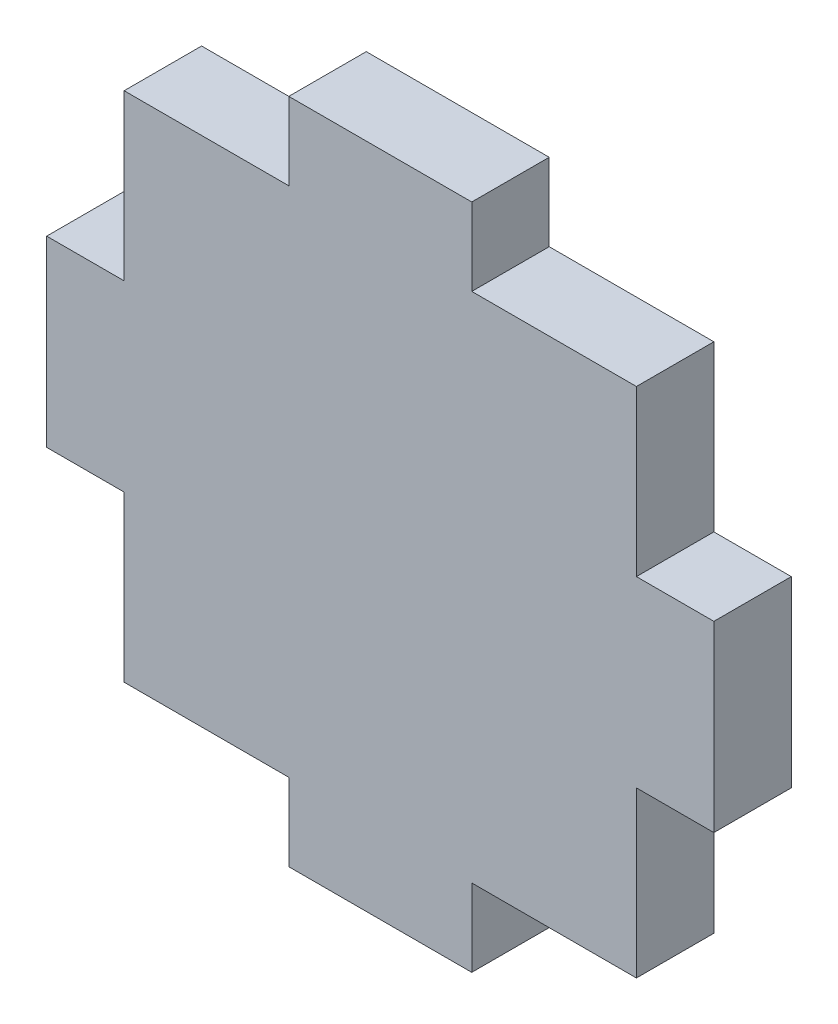
ISO-10303-21;
HEADER;
FILE_DESCRIPTION(('STEP AP214'),'2;1');
FILE_NAME('part.step','',(''),(''),'','','');
FILE_SCHEMA(('AUTOMOTIVE_DESIGN { 1 0 10303 214 1 1 1 1 }'));
ENDSEC;
DATA;
#1=APPLICATION_CONTEXT('core data for automotive mechanical design processes');
#2=APPLICATION_PROTOCOL_DEFINITION('international standard','automotive_design',2000,#1);
#3=PRODUCT_CONTEXT('',#1,'mechanical');
#4=PRODUCT('Part','Part','',(#3));
#5=PRODUCT_RELATED_PRODUCT_CATEGORY('part','',(#4));
#6=PRODUCT_DEFINITION_FORMATION('','',#4);
#7=PRODUCT_DEFINITION_CONTEXT('part definition',#1,'design');
#8=PRODUCT_DEFINITION('design','',#6,#7);
#9=PRODUCT_DEFINITION_SHAPE('','',#8);
#10=(LENGTH_UNIT() NAMED_UNIT(*) SI_UNIT(.MILLI.,.METRE.));
#11=(NAMED_UNIT(*) PLANE_ANGLE_UNIT() SI_UNIT($,.RADIAN.));
#12=(NAMED_UNIT(*) SI_UNIT($,.STERADIAN.) SOLID_ANGLE_UNIT());
#13=UNCERTAINTY_MEASURE_WITH_UNIT(LENGTH_MEASURE(1.E-05),#10,'distance_accuracy_value','');
#14=(GEOMETRIC_REPRESENTATION_CONTEXT(3) GLOBAL_UNCERTAINTY_ASSIGNED_CONTEXT((#13)) GLOBAL_UNIT_ASSIGNED_CONTEXT((#10,
#11,#12)) REPRESENTATION_CONTEXT('',''));
#15=CARTESIAN_POINT('',(0.,0.,0.));
#16=DIRECTION('',(0.,0.,1.));
#17=DIRECTION('',(1.,0.,0.));
#18=AXIS2_PLACEMENT_3D('',#15,#16,#17);
#19=CARTESIAN_POINT('',(-27.35,-27.35,6.35));
#20=DIRECTION('',(1.,0.,0.));
#21=DIRECTION('',(0.,0.,-1.));
#22=AXIS2_PLACEMENT_3D('',#19,#20,#21);
#23=PLANE('',#22);
#24=DIRECTION('',(0.,0.,1.));
#25=VECTOR('',#24,1.);
#26=CARTESIAN_POINT('',(-27.35,-7.50000000000001,0.));
#27=LINE('',#26,#25);
#28=CARTESIAN_POINT('',(-27.35,-7.50000000000001,0.));
#29=VERTEX_POINT('',#28);
#30=CARTESIAN_POINT('',(-27.35,-7.50000000000001,6.35));
#31=VERTEX_POINT('',#30);
#32=EDGE_CURVE('E261',#29,#31,#27,.T.);
#33=ORIENTED_EDGE('',*,*,#32,.T.);
#34=DIRECTION('',(0.,-1.,0.));
#35=VECTOR('',#34,1.);
#36=CARTESIAN_POINT('',(-27.35,-27.35,6.35));
#37=LINE('',#36,#35);
#38=CARTESIAN_POINT('',(-27.35,7.5,6.35));
#39=VERTEX_POINT('',#38);
#40=EDGE_CURVE('E374',#39,#31,#37,.T.);
#41=ORIENTED_EDGE('',*,*,#40,.F.);
#42=DIRECTION('',(0.,0.,1.));
#43=VECTOR('',#42,1.);
#44=CARTESIAN_POINT('',(-27.35,7.5,0.));
#45=LINE('',#44,#43);
#46=CARTESIAN_POINT('',(-27.35,7.5,0.));
#47=VERTEX_POINT('',#46);
#48=EDGE_CURVE('E362',#47,#39,#45,.T.);
#49=ORIENTED_EDGE('',*,*,#48,.F.);
#50=DIRECTION('',(0.,-1.,0.));
#51=VECTOR('',#50,1.);
#52=CARTESIAN_POINT('',(-27.35,-27.35,0.));
#53=LINE('',#52,#51);
#54=EDGE_CURVE('E361',#47,#29,#53,.T.);
#55=ORIENTED_EDGE('',*,*,#54,.T.);
#56=EDGE_LOOP('',(#33,#41,#49,#55));
#57=FACE_BOUND('',#56,.T.);
#58=ADVANCED_FACE('F39',(#57),#23,.F.);
#59=CARTESIAN_POINT('',(27.35,-27.35,6.35));
#60=DIRECTION('',(0.,1.,0.));
#61=DIRECTION('',(-1.,0.,0.));
#62=AXIS2_PLACEMENT_3D('',#59,#60,#61);
#63=PLANE('',#62);
#64=DIRECTION('',(1.,0.,0.));
#65=VECTOR('',#64,1.);
#66=CARTESIAN_POINT('',(27.35,-27.35,6.35));
#67=LINE('',#66,#65);
#68=CARTESIAN_POINT('',(-7.50000000000001,-27.35,6.35));
#69=VERTEX_POINT('',#68);
#70=CARTESIAN_POINT('',(7.49999999999999,-27.35,6.35));
#71=VERTEX_POINT('',#70);
#72=EDGE_CURVE('E378',#69,#71,#67,.T.);
#73=ORIENTED_EDGE('',*,*,#72,.F.);
#74=DIRECTION('',(0.,0.,1.));
#75=VECTOR('',#74,1.);
#76=CARTESIAN_POINT('',(-7.50000000000001,-27.35,0.));
#77=LINE('',#76,#75);
#78=CARTESIAN_POINT('',(-7.50000000000001,-27.35,0.));
#79=VERTEX_POINT('',#78);
#80=EDGE_CURVE('E299',#79,#69,#77,.T.);
#81=ORIENTED_EDGE('',*,*,#80,.F.);
#82=DIRECTION('',(1.,0.,0.));
#83=VECTOR('',#82,1.);
#84=CARTESIAN_POINT('',(27.35,-27.35,0.));
#85=LINE('',#84,#83);
#86=CARTESIAN_POINT('',(7.49999999999999,-27.35,0.));
#87=VERTEX_POINT('',#86);
#88=EDGE_CURVE('E388',#79,#87,#85,.T.);
#89=ORIENTED_EDGE('',*,*,#88,.T.);
#90=DIRECTION('',(0.,0.,1.));
#91=VECTOR('',#90,1.);
#92=CARTESIAN_POINT('',(7.49999999999999,-27.35,0.));
#93=LINE('',#92,#91);
#94=EDGE_CURVE('E276',#87,#71,#93,.T.);
#95=ORIENTED_EDGE('',*,*,#94,.T.);
#96=EDGE_LOOP('',(#73,#81,#89,#95));
#97=FACE_BOUND('',#96,.T.);
#98=ADVANCED_FACE('F426',(#97),#63,.F.);
#99=CARTESIAN_POINT('',(27.35,-27.35,6.35));
#100=DIRECTION('',(-1.,0.,0.));
#101=DIRECTION('',(0.,0.,1.));
#102=AXIS2_PLACEMENT_3D('',#99,#100,#101);
#103=PLANE('',#102);
#104=DIRECTION('',(0.,1.,0.));
#105=VECTOR('',#104,1.);
#106=CARTESIAN_POINT('',(27.35,-27.35,6.35));
#107=LINE('',#106,#105);
#108=CARTESIAN_POINT('',(27.35,-7.5,6.35));
#109=VERTEX_POINT('',#108);
#110=CARTESIAN_POINT('',(27.35,7.50000000000001,6.35));
#111=VERTEX_POINT('',#110);
#112=EDGE_CURVE('E48',#109,#111,#107,.T.);
#113=ORIENTED_EDGE('',*,*,#112,.F.);
#114=DIRECTION('',(0.,0.,1.));
#115=VECTOR('',#114,1.);
#116=CARTESIAN_POINT('',(27.35,-7.5,0.));
#117=LINE('',#116,#115);
#118=CARTESIAN_POINT('',(27.35,-7.5,0.));
#119=VERTEX_POINT('',#118);
#120=EDGE_CURVE('E273',#119,#109,#117,.T.);
#121=ORIENTED_EDGE('',*,*,#120,.F.);
#122=DIRECTION('',(0.,1.,0.));
#123=VECTOR('',#122,1.);
#124=CARTESIAN_POINT('',(27.35,-27.35,0.));
#125=LINE('',#124,#123);
#126=CARTESIAN_POINT('',(27.35,7.50000000000001,0.));
#127=VERTEX_POINT('',#126);
#128=EDGE_CURVE('E391',#119,#127,#125,.T.);
#129=ORIENTED_EDGE('',*,*,#128,.T.);
#130=DIRECTION('',(0.,0.,1.));
#131=VECTOR('',#130,1.);
#132=CARTESIAN_POINT('',(27.35,7.50000000000001,0.));
#133=LINE('',#132,#131);
#134=EDGE_CURVE('E234',#127,#111,#133,.T.);
#135=ORIENTED_EDGE('',*,*,#134,.T.);
#136=EDGE_LOOP('',(#113,#121,#129,#135));
#137=FACE_BOUND('',#136,.T.);
#138=ADVANCED_FACE('F431',(#137),#103,.F.);
#139=CARTESIAN_POINT('',(27.35,27.35,6.35));
#140=DIRECTION('',(0.,-1.,0.));
#141=DIRECTION('',(1.,0.,0.));
#142=AXIS2_PLACEMENT_3D('',#139,#140,#141);
#143=PLANE('',#142);
#144=DIRECTION('',(-1.,0.,0.));
#145=VECTOR('',#144,1.);
#146=CARTESIAN_POINT('',(27.35,27.35,6.35));
#147=LINE('',#146,#145);
#148=CARTESIAN_POINT('',(7.49999999999999,27.35,6.35));
#149=VERTEX_POINT('',#148);
#150=CARTESIAN_POINT('',(-7.50000000000001,27.35,6.35));
#151=VERTEX_POINT('',#150);
#152=EDGE_CURVE('E11',#149,#151,#147,.T.);
#153=ORIENTED_EDGE('',*,*,#152,.F.);
#154=DIRECTION('',(0.,0.,1.));
#155=VECTOR('',#154,1.);
#156=CARTESIAN_POINT('',(7.49999999999999,27.35,0.));
#157=LINE('',#156,#155);
#158=CARTESIAN_POINT('',(7.49999999999999,27.35,0.));
#159=VERTEX_POINT('',#158);
#160=EDGE_CURVE('E231',#159,#149,#157,.T.);
#161=ORIENTED_EDGE('',*,*,#160,.F.);
#162=DIRECTION('',(-1.,0.,0.));
#163=VECTOR('',#162,1.);
#164=CARTESIAN_POINT('',(27.35,27.35,0.));
#165=LINE('',#164,#163);
#166=CARTESIAN_POINT('',(-7.50000000000001,27.35,0.));
#167=VERTEX_POINT('',#166);
#168=EDGE_CURVE('E42',#159,#167,#165,.T.);
#169=ORIENTED_EDGE('',*,*,#168,.T.);
#170=DIRECTION('',(0.,0.,1.));
#171=VECTOR('',#170,1.);
#172=CARTESIAN_POINT('',(-7.50000000000001,27.35,0.));
#173=LINE('',#172,#171);
#174=EDGE_CURVE('E365',#167,#151,#173,.T.);
#175=ORIENTED_EDGE('',*,*,#174,.T.);
#176=EDGE_LOOP('',(#153,#161,#169,#175));
#177=FACE_BOUND('',#176,.T.);
#178=ADVANCED_FACE('F402',(#177),#143,.F.);
#179=CARTESIAN_POINT('',(0.,0.,6.35));
#180=DIRECTION('',(0.,0.,1.));
#181=DIRECTION('',(1.,0.,0.));
#182=AXIS2_PLACEMENT_3D('',#179,#180,#181);
#183=PLANE('',#182);
#184=ORIENTED_EDGE('',*,*,#40,.T.);
#185=DIRECTION('',(1.,0.,0.));
#186=VECTOR('',#185,1.);
#187=CARTESIAN_POINT('',(0.,-7.50000000000001,6.35));
#188=LINE('',#187,#186);
#189=CARTESIAN_POINT('',(-21.,-7.50000000000001,6.35));
#190=VERTEX_POINT('',#189);
#191=EDGE_CURVE('E289',#31,#190,#188,.T.);
#192=ORIENTED_EDGE('',*,*,#191,.T.);
#193=DIRECTION('',(0.,1.,0.));
#194=VECTOR('',#193,1.);
#195=CARTESIAN_POINT('',(-21.,0.,6.35));
#196=LINE('',#195,#194);
#197=CARTESIAN_POINT('',(-21.,-21.,6.35));
#198=VERTEX_POINT('',#197);
#199=EDGE_CURVE('E307',#198,#190,#196,.T.);
#200=ORIENTED_EDGE('',*,*,#199,.F.);
#201=DIRECTION('',(1.,0.,0.));
#202=VECTOR('',#201,1.);
#203=CARTESIAN_POINT('',(0.,-21.,6.35));
#204=LINE('',#203,#202);
#205=CARTESIAN_POINT('',(-7.50000000000001,-21.,6.35));
#206=VERTEX_POINT('',#205);
#207=EDGE_CURVE('E303',#198,#206,#204,.T.);
#208=ORIENTED_EDGE('',*,*,#207,.T.);
#209=DIRECTION('',(0.,1.,0.));
#210=VECTOR('',#209,1.);
#211=CARTESIAN_POINT('',(-7.5,0.,6.35));
#212=LINE('',#211,#210);
#213=EDGE_CURVE('E300',#69,#206,#212,.T.);
#214=ORIENTED_EDGE('',*,*,#213,.F.);
#215=ORIENTED_EDGE('',*,*,#72,.T.);
#216=DIRECTION('',(0.,1.,0.));
#217=VECTOR('',#216,1.);
#218=CARTESIAN_POINT('',(7.49999999999999,0.,6.35));
#219=LINE('',#218,#217);
#220=CARTESIAN_POINT('',(7.49999999999999,-21.,6.35));
#221=VERTEX_POINT('',#220);
#222=EDGE_CURVE('E264',#71,#221,#219,.T.);
#223=ORIENTED_EDGE('',*,*,#222,.T.);
#224=DIRECTION('',(-1.,0.,0.));
#225=VECTOR('',#224,1.);
#226=CARTESIAN_POINT('',(0.,-21.,6.35));
#227=LINE('',#226,#225);
#228=CARTESIAN_POINT('',(21.,-21.,6.35));
#229=VERTEX_POINT('',#228);
#230=EDGE_CURVE('E260',#229,#221,#227,.T.);
#231=ORIENTED_EDGE('',*,*,#230,.F.);
#232=DIRECTION('',(0.,1.,0.));
#233=VECTOR('',#232,1.);
#234=CARTESIAN_POINT('',(21.,0.,6.35));
#235=LINE('',#234,#233);
#236=CARTESIAN_POINT('',(21.,-7.5,6.35));
#237=VERTEX_POINT('',#236);
#238=EDGE_CURVE('E256',#229,#237,#235,.T.);
#239=ORIENTED_EDGE('',*,*,#238,.T.);
#240=DIRECTION('',(-1.,0.,0.));
#241=VECTOR('',#240,1.);
#242=CARTESIAN_POINT('',(0.,-7.50000000000001,6.35));
#243=LINE('',#242,#241);
#244=EDGE_CURVE('E244',#109,#237,#243,.T.);
#245=ORIENTED_EDGE('',*,*,#244,.F.);
#246=ORIENTED_EDGE('',*,*,#112,.T.);
#247=DIRECTION('',(-1.,0.,0.));
#248=VECTOR('',#247,1.);
#249=CARTESIAN_POINT('',(0.,7.50000000000001,6.35));
#250=LINE('',#249,#248);
#251=CARTESIAN_POINT('',(21.,7.50000000000001,6.35));
#252=VERTEX_POINT('',#251);
#253=EDGE_CURVE('E211',#111,#252,#250,.T.);
#254=ORIENTED_EDGE('',*,*,#253,.T.);
#255=DIRECTION('',(0.,-1.,0.));
#256=VECTOR('',#255,1.);
#257=CARTESIAN_POINT('',(21.,0.,6.35));
#258=LINE('',#257,#256);
#259=CARTESIAN_POINT('',(21.,21.,6.35));
#260=VERTEX_POINT('',#259);
#261=EDGE_CURVE('E220',#260,#252,#258,.T.);
#262=ORIENTED_EDGE('',*,*,#261,.F.);
#263=DIRECTION('',(-1.,0.,0.));
#264=VECTOR('',#263,1.);
#265=CARTESIAN_POINT('',(0.,21.,6.35));
#266=LINE('',#265,#264);
#267=CARTESIAN_POINT('',(7.49999999999999,21.,6.35));
#268=VERTEX_POINT('',#267);
#269=EDGE_CURVE('E185',#260,#268,#266,.T.);
#270=ORIENTED_EDGE('',*,*,#269,.T.);
#271=DIRECTION('',(0.,-1.,0.));
#272=VECTOR('',#271,1.);
#273=CARTESIAN_POINT('',(7.49999999999999,0.,6.35));
#274=LINE('',#273,#272);
#275=EDGE_CURVE('E207',#149,#268,#274,.T.);
#276=ORIENTED_EDGE('',*,*,#275,.F.);
#277=ORIENTED_EDGE('',*,*,#152,.T.);
#278=DIRECTION('',(0.,-1.,0.));
#279=VECTOR('',#278,1.);
#280=CARTESIAN_POINT('',(-7.50000000000002,0.,6.35));
#281=LINE('',#280,#279);
#282=CARTESIAN_POINT('',(-7.50000000000001,21.,6.35));
#283=VERTEX_POINT('',#282);
#284=EDGE_CURVE('E351',#151,#283,#281,.T.);
#285=ORIENTED_EDGE('',*,*,#284,.T.);
#286=DIRECTION('',(1.,0.,0.));
#287=VECTOR('',#286,1.);
#288=CARTESIAN_POINT('',(0.,21.,6.35));
#289=LINE('',#288,#287);
#290=CARTESIAN_POINT('',(-21.,21.,6.35));
#291=VERTEX_POINT('',#290);
#292=EDGE_CURVE('E347',#291,#283,#289,.T.);
#293=ORIENTED_EDGE('',*,*,#292,.F.);
#294=DIRECTION('',(0.,-1.,0.));
#295=VECTOR('',#294,1.);
#296=CARTESIAN_POINT('',(-21.,0.,6.35));
#297=LINE('',#296,#295);
#298=CARTESIAN_POINT('',(-21.,7.5,6.35));
#299=VERTEX_POINT('',#298);
#300=EDGE_CURVE('E230',#291,#299,#297,.T.);
#301=ORIENTED_EDGE('',*,*,#300,.T.);
#302=DIRECTION('',(1.,0.,0.));
#303=VECTOR('',#302,1.);
#304=CARTESIAN_POINT('',(0.,7.5,6.35));
#305=LINE('',#304,#303);
#306=EDGE_CURVE('E331',#39,#299,#305,.T.);
#307=ORIENTED_EDGE('',*,*,#306,.F.);
#308=EDGE_LOOP('',(#184,#192,#200,#208,#214,#215,#223,#231,#239,#245,#246,#254,#262,#270,#276,
#277,#285,#293,#301,#307));
#309=FACE_BOUND('',#308,.T.);
#310=ADVANCED_FACE('F410',(#309),#183,.T.);
#311=CARTESIAN_POINT('',(0.,0.,0.));
#312=DIRECTION('',(0.,0.,1.));
#313=DIRECTION('',(1.,0.,0.));
#314=AXIS2_PLACEMENT_3D('',#311,#312,#313);
#315=PLANE('',#314);
#316=DIRECTION('',(1.,0.,0.));
#317=VECTOR('',#316,1.);
#318=CARTESIAN_POINT('',(0.,-7.50000000000001,0.));
#319=LINE('',#318,#317);
#320=CARTESIAN_POINT('',(-21.,-7.50000000000001,0.));
#321=VERTEX_POINT('',#320);
#322=EDGE_CURVE('E296',#29,#321,#319,.T.);
#323=ORIENTED_EDGE('',*,*,#322,.F.);
#324=ORIENTED_EDGE('',*,*,#54,.F.);
#325=DIRECTION('',(1.,0.,0.));
#326=VECTOR('',#325,1.);
#327=CARTESIAN_POINT('',(0.,7.5,0.));
#328=LINE('',#327,#326);
#329=CARTESIAN_POINT('',(-21.,7.5,0.));
#330=VERTEX_POINT('',#329);
#331=EDGE_CURVE('E339',#47,#330,#328,.T.);
#332=ORIENTED_EDGE('',*,*,#331,.T.);
#333=DIRECTION('',(0.,-1.,0.));
#334=VECTOR('',#333,1.);
#335=CARTESIAN_POINT('',(-21.,0.,0.));
#336=LINE('',#335,#334);
#337=CARTESIAN_POINT('',(-21.,21.,0.));
#338=VERTEX_POINT('',#337);
#339=EDGE_CURVE('E327',#338,#330,#336,.T.);
#340=ORIENTED_EDGE('',*,*,#339,.F.);
#341=DIRECTION('',(1.,0.,0.));
#342=VECTOR('',#341,1.);
#343=CARTESIAN_POINT('',(0.,21.,0.));
#344=LINE('',#343,#342);
#345=CARTESIAN_POINT('',(-7.50000000000001,21.,0.));
#346=VERTEX_POINT('',#345);
#347=EDGE_CURVE('E330',#338,#346,#344,.T.);
#348=ORIENTED_EDGE('',*,*,#347,.T.);
#349=DIRECTION('',(0.,-1.,0.));
#350=VECTOR('',#349,1.);
#351=CARTESIAN_POINT('',(-7.50000000000002,0.,0.));
#352=LINE('',#351,#350);
#353=EDGE_CURVE('E335',#167,#346,#352,.T.);
#354=ORIENTED_EDGE('',*,*,#353,.F.);
#355=ORIENTED_EDGE('',*,*,#168,.F.);
#356=DIRECTION('',(0.,-1.,0.));
#357=VECTOR('',#356,1.);
#358=CARTESIAN_POINT('',(7.49999999999999,0.,0.));
#359=LINE('',#358,#357);
#360=CARTESIAN_POINT('',(7.49999999999999,21.,0.));
#361=VERTEX_POINT('',#360);
#362=EDGE_CURVE('E191',#159,#361,#359,.T.);
#363=ORIENTED_EDGE('',*,*,#362,.T.);
#364=DIRECTION('',(-1.,0.,0.));
#365=VECTOR('',#364,1.);
#366=CARTESIAN_POINT('',(0.,21.,0.));
#367=LINE('',#366,#365);
#368=CARTESIAN_POINT('',(21.,21.,0.));
#369=VERTEX_POINT('',#368);
#370=EDGE_CURVE('E182',#369,#361,#367,.T.);
#371=ORIENTED_EDGE('',*,*,#370,.F.);
#372=DIRECTION('',(0.,-1.,0.));
#373=VECTOR('',#372,1.);
#374=CARTESIAN_POINT('',(21.,0.,0.));
#375=LINE('',#374,#373);
#376=CARTESIAN_POINT('',(21.,7.50000000000001,0.));
#377=VERTEX_POINT('',#376);
#378=EDGE_CURVE('E194',#369,#377,#375,.T.);
#379=ORIENTED_EDGE('',*,*,#378,.T.);
#380=DIRECTION('',(-1.,0.,0.));
#381=VECTOR('',#380,1.);
#382=CARTESIAN_POINT('',(0.,7.50000000000001,0.));
#383=LINE('',#382,#381);
#384=EDGE_CURVE('E200',#127,#377,#383,.T.);
#385=ORIENTED_EDGE('',*,*,#384,.F.);
#386=ORIENTED_EDGE('',*,*,#128,.F.);
#387=DIRECTION('',(-1.,0.,0.));
#388=VECTOR('',#387,1.);
#389=CARTESIAN_POINT('',(0.,-7.50000000000001,0.));
#390=LINE('',#389,#388);
#391=CARTESIAN_POINT('',(21.,-7.5,0.));
#392=VERTEX_POINT('',#391);
#393=EDGE_CURVE('E251',#119,#392,#390,.T.);
#394=ORIENTED_EDGE('',*,*,#393,.T.);
#395=DIRECTION('',(0.,1.,0.));
#396=VECTOR('',#395,1.);
#397=CARTESIAN_POINT('',(21.,0.,0.));
#398=LINE('',#397,#396);
#399=CARTESIAN_POINT('',(21.,-21.,0.));
#400=VERTEX_POINT('',#399);
#401=EDGE_CURVE('E240',#400,#392,#398,.T.);
#402=ORIENTED_EDGE('',*,*,#401,.F.);
#403=DIRECTION('',(-1.,0.,0.));
#404=VECTOR('',#403,1.);
#405=CARTESIAN_POINT('',(0.,-21.,0.));
#406=LINE('',#405,#404);
#407=CARTESIAN_POINT('',(7.49999999999999,-21.,0.));
#408=VERTEX_POINT('',#407);
#409=EDGE_CURVE('E243',#400,#408,#406,.T.);
#410=ORIENTED_EDGE('',*,*,#409,.T.);
#411=DIRECTION('',(0.,1.,0.));
#412=VECTOR('',#411,1.);
#413=CARTESIAN_POINT('',(7.49999999999999,0.,0.));
#414=LINE('',#413,#412);
#415=EDGE_CURVE('E248',#87,#408,#414,.T.);
#416=ORIENTED_EDGE('',*,*,#415,.F.);
#417=ORIENTED_EDGE('',*,*,#88,.F.);
#418=DIRECTION('',(0.,1.,0.));
#419=VECTOR('',#418,1.);
#420=CARTESIAN_POINT('',(-7.5,0.,0.));
#421=LINE('',#420,#419);
#422=CARTESIAN_POINT('',(-7.50000000000001,-21.,0.));
#423=VERTEX_POINT('',#422);
#424=EDGE_CURVE('E284',#79,#423,#421,.T.);
#425=ORIENTED_EDGE('',*,*,#424,.T.);
#426=DIRECTION('',(1.,0.,0.));
#427=VECTOR('',#426,1.);
#428=CARTESIAN_POINT('',(0.,-21.,0.));
#429=LINE('',#428,#427);
#430=CARTESIAN_POINT('',(-21.,-21.,0.));
#431=VERTEX_POINT('',#430);
#432=EDGE_CURVE('E288',#431,#423,#429,.T.);
#433=ORIENTED_EDGE('',*,*,#432,.F.);
#434=DIRECTION('',(0.,1.,0.));
#435=VECTOR('',#434,1.);
#436=CARTESIAN_POINT('',(-21.,0.,0.));
#437=LINE('',#436,#435);
#438=EDGE_CURVE('E292',#431,#321,#437,.T.);
#439=ORIENTED_EDGE('',*,*,#438,.T.);
#440=EDGE_LOOP('',(#323,#324,#332,#340,#348,#354,#355,#363,#371,#379,#385,#386,#394,#402,#410,
#416,#417,#425,#433,#439));
#441=FACE_BOUND('',#440,.T.);
#442=ADVANCED_FACE('F204',(#441),#315,.F.);
#443=CARTESIAN_POINT('',(-21.,0.,0.));
#444=DIRECTION('',(-1.,0.,0.));
#445=DIRECTION('',(0.,-1.,0.));
#446=AXIS2_PLACEMENT_3D('',#443,#444,#445);
#447=PLANE('',#446);
#448=ORIENTED_EDGE('',*,*,#300,.F.);
#449=DIRECTION('',(0.,0.,1.));
#450=VECTOR('',#449,1.);
#451=CARTESIAN_POINT('',(-21.,21.,0.));
#452=LINE('',#451,#450);
#453=EDGE_CURVE('E343',#338,#291,#452,.T.);
#454=ORIENTED_EDGE('',*,*,#453,.F.);
#455=ORIENTED_EDGE('',*,*,#339,.T.);
#456=DIRECTION('',(0.,0.,1.));
#457=VECTOR('',#456,1.);
#458=CARTESIAN_POINT('',(-21.,7.5,0.));
#459=LINE('',#458,#457);
#460=EDGE_CURVE('E358',#330,#299,#459,.T.);
#461=ORIENTED_EDGE('',*,*,#460,.T.);
#462=EDGE_LOOP('',(#448,#454,#455,#461));
#463=FACE_BOUND('',#462,.T.);
#464=ADVANCED_FACE('F480',(#463),#447,.T.);
#465=CARTESIAN_POINT('',(0.,7.5,0.));
#466=DIRECTION('',(0.,-1.,0.));
#467=DIRECTION('',(1.,0.,0.));
#468=AXIS2_PLACEMENT_3D('',#465,#466,#467);
#469=PLANE('',#468);
#470=ORIENTED_EDGE('',*,*,#306,.T.);
#471=ORIENTED_EDGE('',*,*,#460,.F.);
#472=ORIENTED_EDGE('',*,*,#331,.F.);
#473=ORIENTED_EDGE('',*,*,#48,.T.);
#474=EDGE_LOOP('',(#470,#471,#472,#473));
#475=FACE_BOUND('',#474,.T.);
#476=ADVANCED_FACE('F442',(#475),#469,.F.);
#477=CARTESIAN_POINT('',(-7.50000000000002,0.,0.));
#478=DIRECTION('',(-1.,0.,0.));
#479=DIRECTION('',(0.,-1.,0.));
#480=AXIS2_PLACEMENT_3D('',#477,#478,#479);
#481=PLANE('',#480);
#482=ORIENTED_EDGE('',*,*,#284,.F.);
#483=ORIENTED_EDGE('',*,*,#174,.F.);
#484=ORIENTED_EDGE('',*,*,#353,.T.);
#485=DIRECTION('',(0.,0.,1.));
#486=VECTOR('',#485,1.);
#487=CARTESIAN_POINT('',(-7.50000000000001,21.,0.));
#488=LINE('',#487,#486);
#489=EDGE_CURVE('E369',#346,#283,#488,.T.);
#490=ORIENTED_EDGE('',*,*,#489,.T.);
#491=EDGE_LOOP('',(#482,#483,#484,#490));
#492=FACE_BOUND('',#491,.T.);
#493=ADVANCED_FACE('F407',(#492),#481,.T.);
#494=CARTESIAN_POINT('',(0.,21.,0.));
#495=DIRECTION('',(0.,-1.,0.));
#496=DIRECTION('',(0.,0.,-1.));
#497=AXIS2_PLACEMENT_3D('',#494,#495,#496);
#498=PLANE('',#497);
#499=ORIENTED_EDGE('',*,*,#292,.T.);
#500=ORIENTED_EDGE('',*,*,#489,.F.);
#501=ORIENTED_EDGE('',*,*,#347,.F.);
#502=ORIENTED_EDGE('',*,*,#453,.T.);
#503=EDGE_LOOP('',(#499,#500,#501,#502));
#504=FACE_BOUND('',#503,.T.);
#505=ADVANCED_FACE('F423',(#504),#498,.F.);
#506=CARTESIAN_POINT('',(0.,21.,0.));
#507=DIRECTION('',(0.,1.,0.));
#508=DIRECTION('',(0.,0.,1.));
#509=AXIS2_PLACEMENT_3D('',#506,#507,#508);
#510=PLANE('',#509);
#511=ORIENTED_EDGE('',*,*,#269,.F.);
#512=DIRECTION('',(0.,0.,1.));
#513=VECTOR('',#512,1.);
#514=CARTESIAN_POINT('',(21.,21.,0.));
#515=LINE('',#514,#513);
#516=EDGE_CURVE('E178',#369,#260,#515,.T.);
#517=ORIENTED_EDGE('',*,*,#516,.F.);
#518=ORIENTED_EDGE('',*,*,#370,.T.);
#519=DIRECTION('',(0.,0.,1.));
#520=VECTOR('',#519,1.);
#521=CARTESIAN_POINT('',(7.49999999999999,21.,0.));
#522=LINE('',#521,#520);
#523=EDGE_CURVE('E227',#361,#268,#522,.T.);
#524=ORIENTED_EDGE('',*,*,#523,.T.);
#525=EDGE_LOOP('',(#511,#517,#518,#524));
#526=FACE_BOUND('',#525,.T.);
#527=ADVANCED_FACE('F180',(#526),#510,.T.);
#528=CARTESIAN_POINT('',(7.49999999999999,0.,0.));
#529=DIRECTION('',(-1.,0.,0.));
#530=DIRECTION('',(0.,0.,1.));
#531=AXIS2_PLACEMENT_3D('',#528,#529,#530);
#532=PLANE('',#531);
#533=ORIENTED_EDGE('',*,*,#275,.T.);
#534=ORIENTED_EDGE('',*,*,#523,.F.);
#535=ORIENTED_EDGE('',*,*,#362,.F.);
#536=ORIENTED_EDGE('',*,*,#160,.T.);
#537=EDGE_LOOP('',(#533,#534,#535,#536));
#538=FACE_BOUND('',#537,.T.);
#539=ADVANCED_FACE('F413',(#538),#532,.F.);
#540=CARTESIAN_POINT('',(0.,7.50000000000001,0.));
#541=DIRECTION('',(0.,1.,0.));
#542=DIRECTION('',(0.,0.,1.));
#543=AXIS2_PLACEMENT_3D('',#540,#541,#542);
#544=PLANE('',#543);
#545=ORIENTED_EDGE('',*,*,#253,.F.);
#546=ORIENTED_EDGE('',*,*,#134,.F.);
#547=ORIENTED_EDGE('',*,*,#384,.T.);
#548=DIRECTION('',(0.,0.,1.));
#549=VECTOR('',#548,1.);
#550=CARTESIAN_POINT('',(21.,7.50000000000001,0.));
#551=LINE('',#550,#549);
#552=EDGE_CURVE('E190',#377,#252,#551,.T.);
#553=ORIENTED_EDGE('',*,*,#552,.T.);
#554=EDGE_LOOP('',(#545,#546,#547,#553));
#555=FACE_BOUND('',#554,.T.);
#556=ADVANCED_FACE('F415',(#555),#544,.T.);
#557=CARTESIAN_POINT('',(21.,0.,0.));
#558=DIRECTION('',(-1.,0.,0.));
#559=DIRECTION('',(0.,-1.,0.));
#560=AXIS2_PLACEMENT_3D('',#557,#558,#559);
#561=PLANE('',#560);
#562=ORIENTED_EDGE('',*,*,#261,.T.);
#563=ORIENTED_EDGE('',*,*,#552,.F.);
#564=ORIENTED_EDGE('',*,*,#378,.F.);
#565=ORIENTED_EDGE('',*,*,#516,.T.);
#566=EDGE_LOOP('',(#562,#563,#564,#565));
#567=FACE_BOUND('',#566,.T.);
#568=ADVANCED_FACE('F195',(#567),#561,.F.);
#569=CARTESIAN_POINT('',(21.,0.,0.));
#570=DIRECTION('',(1.,0.,0.));
#571=DIRECTION('',(0.,0.,-1.));
#572=AXIS2_PLACEMENT_3D('',#569,#570,#571);
#573=PLANE('',#572);
#574=ORIENTED_EDGE('',*,*,#238,.F.);
#575=DIRECTION('',(0.,0.,1.));
#576=VECTOR('',#575,1.);
#577=CARTESIAN_POINT('',(21.,-21.,0.));
#578=LINE('',#577,#576);
#579=EDGE_CURVE('E255',#400,#229,#578,.T.);
#580=ORIENTED_EDGE('',*,*,#579,.F.);
#581=ORIENTED_EDGE('',*,*,#401,.T.);
#582=DIRECTION('',(0.,0.,1.));
#583=VECTOR('',#582,1.);
#584=CARTESIAN_POINT('',(21.,-7.5,0.));
#585=LINE('',#584,#583);
#586=EDGE_CURVE('E221',#392,#237,#585,.T.);
#587=ORIENTED_EDGE('',*,*,#586,.T.);
#588=EDGE_LOOP('',(#574,#580,#581,#587));
#589=FACE_BOUND('',#588,.T.);
#590=ADVANCED_FACE('F466',(#589),#573,.T.);
#591=CARTESIAN_POINT('',(0.,-7.50000000000001,0.));
#592=DIRECTION('',(0.,1.,0.));
#593=DIRECTION('',(-1.,0.,0.));
#594=AXIS2_PLACEMENT_3D('',#591,#592,#593);
#595=PLANE('',#594);
#596=ORIENTED_EDGE('',*,*,#244,.T.);
#597=ORIENTED_EDGE('',*,*,#586,.F.);
#598=ORIENTED_EDGE('',*,*,#393,.F.);
#599=ORIENTED_EDGE('',*,*,#120,.T.);
#600=EDGE_LOOP('',(#596,#597,#598,#599));
#601=FACE_BOUND('',#600,.T.);
#602=ADVANCED_FACE('F469',(#601),#595,.F.);
#603=CARTESIAN_POINT('',(7.49999999999999,0.,0.));
#604=DIRECTION('',(1.,0.,0.));
#605=DIRECTION('',(0.,0.,-1.));
#606=AXIS2_PLACEMENT_3D('',#603,#604,#605);
#607=PLANE('',#606);
#608=ORIENTED_EDGE('',*,*,#222,.F.);
#609=ORIENTED_EDGE('',*,*,#94,.F.);
#610=ORIENTED_EDGE('',*,*,#415,.T.);
#611=DIRECTION('',(0.,0.,1.));
#612=VECTOR('',#611,1.);
#613=CARTESIAN_POINT('',(7.49999999999999,-21.,0.));
#614=LINE('',#613,#612);
#615=EDGE_CURVE('E64',#408,#221,#614,.T.);
#616=ORIENTED_EDGE('',*,*,#615,.T.);
#617=EDGE_LOOP('',(#608,#609,#610,#616));
#618=FACE_BOUND('',#617,.T.);
#619=ADVANCED_FACE('F460',(#618),#607,.T.);
#620=CARTESIAN_POINT('',(0.,-21.,0.));
#621=DIRECTION('',(0.,1.,0.));
#622=DIRECTION('',(-1.,0.,0.));
#623=AXIS2_PLACEMENT_3D('',#620,#621,#622);
#624=PLANE('',#623);
#625=ORIENTED_EDGE('',*,*,#230,.T.);
#626=ORIENTED_EDGE('',*,*,#615,.F.);
#627=ORIENTED_EDGE('',*,*,#409,.F.);
#628=ORIENTED_EDGE('',*,*,#579,.T.);
#629=EDGE_LOOP('',(#625,#626,#627,#628));
#630=FACE_BOUND('',#629,.T.);
#631=ADVANCED_FACE('F464',(#630),#624,.F.);
#632=CARTESIAN_POINT('',(0.,-7.50000000000001,0.));
#633=DIRECTION('',(0.,-1.,0.));
#634=DIRECTION('',(0.,0.,-1.));
#635=AXIS2_PLACEMENT_3D('',#632,#633,#634);
#636=PLANE('',#635);
#637=ORIENTED_EDGE('',*,*,#191,.F.);
#638=ORIENTED_EDGE('',*,*,#32,.F.);
#639=ORIENTED_EDGE('',*,*,#322,.T.);
#640=DIRECTION('',(0.,0.,1.));
#641=VECTOR('',#640,1.);
#642=CARTESIAN_POINT('',(-21.,-7.50000000000001,0.));
#643=LINE('',#642,#641);
#644=EDGE_CURVE('E317',#321,#190,#643,.T.);
#645=ORIENTED_EDGE('',*,*,#644,.T.);
#646=EDGE_LOOP('',(#637,#638,#639,#645));
#647=FACE_BOUND('',#646,.T.);
#648=ADVANCED_FACE('F446',(#647),#636,.T.);
#649=CARTESIAN_POINT('',(-21.,0.,0.));
#650=DIRECTION('',(1.,0.,0.));
#651=DIRECTION('',(0.,0.,-1.));
#652=AXIS2_PLACEMENT_3D('',#649,#650,#651);
#653=PLANE('',#652);
#654=ORIENTED_EDGE('',*,*,#199,.T.);
#655=ORIENTED_EDGE('',*,*,#644,.F.);
#656=ORIENTED_EDGE('',*,*,#438,.F.);
#657=DIRECTION('',(0.,0.,1.));
#658=VECTOR('',#657,1.);
#659=CARTESIAN_POINT('',(-21.,-21.,0.));
#660=LINE('',#659,#658);
#661=EDGE_CURVE('E320',#431,#198,#660,.T.);
#662=ORIENTED_EDGE('',*,*,#661,.T.);
#663=EDGE_LOOP('',(#654,#655,#656,#662));
#664=FACE_BOUND('',#663,.T.);
#665=ADVANCED_FACE('F448',(#664),#653,.F.);
#666=CARTESIAN_POINT('',(0.,-21.,0.));
#667=DIRECTION('',(0.,-1.,0.));
#668=DIRECTION('',(0.,0.,-1.));
#669=AXIS2_PLACEMENT_3D('',#666,#667,#668);
#670=PLANE('',#669);
#671=ORIENTED_EDGE('',*,*,#207,.F.);
#672=ORIENTED_EDGE('',*,*,#661,.F.);
#673=ORIENTED_EDGE('',*,*,#432,.T.);
#674=DIRECTION('',(0.,0.,1.));
#675=VECTOR('',#674,1.);
#676=CARTESIAN_POINT('',(-7.50000000000001,-21.,0.));
#677=LINE('',#676,#675);
#678=EDGE_CURVE('E56',#423,#206,#677,.T.);
#679=ORIENTED_EDGE('',*,*,#678,.T.);
#680=EDGE_LOOP('',(#671,#672,#673,#679));
#681=FACE_BOUND('',#680,.T.);
#682=ADVANCED_FACE('F453',(#681),#670,.T.);
#683=CARTESIAN_POINT('',(-7.5,0.,0.));
#684=DIRECTION('',(1.,0.,0.));
#685=DIRECTION('',(0.,1.,0.));
#686=AXIS2_PLACEMENT_3D('',#683,#684,#685);
#687=PLANE('',#686);
#688=ORIENTED_EDGE('',*,*,#213,.T.);
#689=ORIENTED_EDGE('',*,*,#678,.F.);
#690=ORIENTED_EDGE('',*,*,#424,.F.);
#691=ORIENTED_EDGE('',*,*,#80,.T.);
#692=EDGE_LOOP('',(#688,#689,#690,#691));
#693=FACE_BOUND('',#692,.T.);
#694=ADVANCED_FACE('F454',(#693),#687,.F.);
#695=CLOSED_SHELL('',(#58,#98,#138,#178,#310,#442,#464,#476,#493,#505,#527,#539,#556,#568,#590,
#602,#619,#631,#648,#665,#682,#694));
#696=MANIFOLD_SOLID_BREP('B2',#695);
#697=ADVANCED_BREP_SHAPE_REPRESENTATION('',(#18,#696),#14);
#698=SHAPE_DEFINITION_REPRESENTATION(#9,#697);
ENDSEC;
END-ISO-10303-21;
